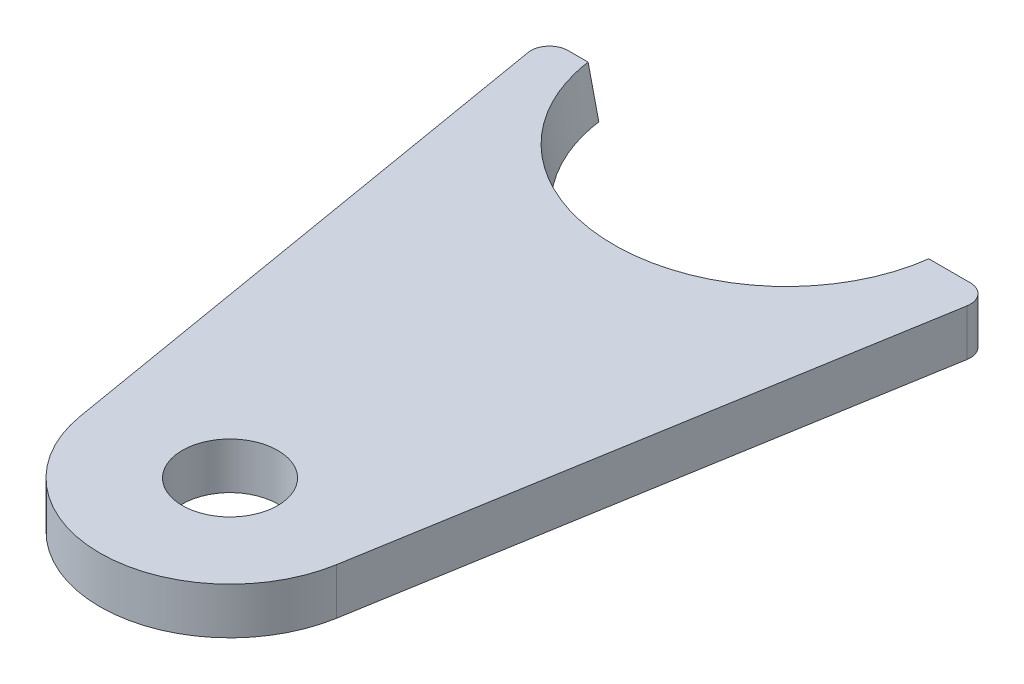
ISO-10303-21;
HEADER;
FILE_DESCRIPTION(('STEP AP214'),'2;1');
FILE_NAME('part.step','',(''),(''),'','','');
FILE_SCHEMA(('AUTOMOTIVE_DESIGN { 1 0 10303 214 1 1 1 1 }'));
ENDSEC;
DATA;
#1=APPLICATION_CONTEXT('core data for automotive mechanical design processes');
#2=APPLICATION_PROTOCOL_DEFINITION('international standard','automotive_design',2000,#1);
#3=PRODUCT_CONTEXT('',#1,'mechanical');
#4=PRODUCT('Part','Part','',(#3));
#5=PRODUCT_RELATED_PRODUCT_CATEGORY('part','',(#4));
#6=PRODUCT_DEFINITION_FORMATION('','',#4);
#7=PRODUCT_DEFINITION_CONTEXT('part definition',#1,'design');
#8=PRODUCT_DEFINITION('design','',#6,#7);
#9=PRODUCT_DEFINITION_SHAPE('','',#8);
#10=(LENGTH_UNIT() NAMED_UNIT(*) SI_UNIT(.MILLI.,.METRE.));
#11=(NAMED_UNIT(*) PLANE_ANGLE_UNIT() SI_UNIT($,.RADIAN.));
#12=(NAMED_UNIT(*) SI_UNIT($,.STERADIAN.) SOLID_ANGLE_UNIT());
#13=UNCERTAINTY_MEASURE_WITH_UNIT(LENGTH_MEASURE(1.E-05),#10,'distance_accuracy_value','');
#14=(GEOMETRIC_REPRESENTATION_CONTEXT(3) GLOBAL_UNCERTAINTY_ASSIGNED_CONTEXT((#13)) GLOBAL_UNIT_ASSIGNED_CONTEXT((#10,
#11,#12)) REPRESENTATION_CONTEXT('',''));
#15=CARTESIAN_POINT('',(0.,0.,0.));
#16=DIRECTION('',(0.,0.,1.));
#17=DIRECTION('',(1.,0.,0.));
#18=AXIS2_PLACEMENT_3D('',#15,#16,#17);
#19=CARTESIAN_POINT('',(0.,3.175,-36.83));
#20=DIRECTION('',(0.,0.,1.));
#21=DIRECTION('',(-1.,0.,0.));
#22=AXIS2_PLACEMENT_3D('',#19,#20,#21);
#23=PLANE('',#22);
#24=DIRECTION('',(1.,0.,0.));
#25=VECTOR('',#24,1.);
#26=CARTESIAN_POINT('',(0.,0.,-36.83));
#27=LINE('',#26,#25);
#28=CARTESIAN_POINT('',(11.6522737852072,0.,-36.83));
#29=VERTEX_POINT('',#28);
#30=CARTESIAN_POINT('',(13.7373742029562,0.,-36.83));
#31=VERTEX_POINT('',#30);
#32=EDGE_CURVE('E142',#29,#31,#27,.T.);
#33=ORIENTED_EDGE('',*,*,#32,.F.);
#34=CARTESIAN_POINT('',(15.4654164635902,-66.1988718553639,-36.83));
#35=DIRECTION('',(0.,0.,-1.));
#36=DIRECTION('',(0.227494846304663,-0.973779284491521,0.));
#37=AXIS2_PLACEMENT_3D('',#34,#35,#36);
#38=ELLIPSE('',#37,542.25801557008,11.43);
#39=CARTESIAN_POINT('',(10.9017405762271,3.175,-36.83));
#40=VERTEX_POINT('',#39);
#41=EDGE_CURVE('E123',#29,#40,#38,.F.);
#42=ORIENTED_EDGE('',*,*,#41,.T.);
#43=DIRECTION('',(1.,0.,0.));
#44=VECTOR('',#43,1.);
#45=CARTESIAN_POINT('',(0.,3.175,-36.83));
#46=LINE('',#45,#44);
#47=CARTESIAN_POINT('',(13.7373742029562,3.175,-36.83));
#48=VERTEX_POINT('',#47);
#49=EDGE_CURVE('E205',#40,#48,#46,.T.);
#50=ORIENTED_EDGE('',*,*,#49,.T.);
#51=DIRECTION('',(0.,-1.,0.));
#52=VECTOR('',#51,1.);
#53=CARTESIAN_POINT('',(13.7373742029562,3.175,-36.83));
#54=LINE('',#53,#52);
#55=EDGE_CURVE('E11',#31,#48,#54,.F.);
#56=ORIENTED_EDGE('',*,*,#55,.F.);
#57=EDGE_LOOP('',(#33,#42,#50,#56));
#58=FACE_BOUND('',#57,.T.);
#59=ADVANCED_FACE('F51',(#58),#23,.F.);
#60=CARTESIAN_POINT('',(-8.76571505055445,3.175,1.48133036574667));
#61=DIRECTION('',(-0.986019690726035,0.,0.166628837541807));
#62=DIRECTION('',(-0.166628837541807,0.,-0.986019690726035));
#63=AXIS2_PLACEMENT_3D('',#60,#61,#62);
#64=PLANE('',#63);
#65=DIRECTION('',(0.166628837541807,0.,0.986019690726035));
#66=VECTOR('',#65,1.);
#67=CARTESIAN_POINT('',(-8.76571505055445,0.,1.48133036574667));
#68=LINE('',#67,#66);
#69=CARTESIAN_POINT('',(-14.9896192101783,0.,-35.3483813763219));
#70=VERTEX_POINT('',#69);
#71=CARTESIAN_POINT('',(-8.76571505055445,0.,1.48133036574667));
#72=VERTEX_POINT('',#71);
#73=EDGE_CURVE('E151',#70,#72,#68,.T.);
#74=ORIENTED_EDGE('',*,*,#73,.T.);
#75=DIRECTION('',(0.,-1.,0.));
#76=VECTOR('',#75,1.);
#77=CARTESIAN_POINT('',(-8.76571505055445,3.175,1.48133036574667));
#78=LINE('',#77,#76);
#79=CARTESIAN_POINT('',(-8.76571505055445,3.175,1.48133036574667));
#80=VERTEX_POINT('',#79);
#81=EDGE_CURVE('E140',#80,#72,#78,.T.);
#82=ORIENTED_EDGE('',*,*,#81,.F.);
#83=DIRECTION('',(0.166628837541807,0.,0.986019690726035));
#84=VECTOR('',#83,1.);
#85=CARTESIAN_POINT('',(-8.76571505055445,3.175,1.48133036574667));
#86=LINE('',#85,#84);
#87=CARTESIAN_POINT('',(-14.9896192101783,3.175,-35.3483813763219));
#88=VERTEX_POINT('',#87);
#89=EDGE_CURVE('E206',#88,#80,#86,.T.);
#90=ORIENTED_EDGE('',*,*,#89,.F.);
#91=DIRECTION('',(0.,-1.,0.));
#92=VECTOR('',#91,1.);
#93=CARTESIAN_POINT('',(-14.9896192101783,3.175,-35.3483813763219));
#94=LINE('',#93,#92);
#95=EDGE_CURVE('E168',#70,#88,#94,.F.);
#96=ORIENTED_EDGE('',*,*,#95,.F.);
#97=EDGE_LOOP('',(#74,#82,#90,#96));
#98=FACE_BOUND('',#97,.T.);
#99=ADVANCED_FACE('F224',(#98),#64,.T.);
#100=CARTESIAN_POINT('',(-13.7373742029562,3.175,-36.83));
#101=VERTEX_POINT('',#100);
#102=CARTESIAN_POINT('',(-12.3700435462939,3.175,-36.83));
#103=VERTEX_POINT('',#102);
#104=EDGE_CURVE('E145',#101,#103,#46,.T.);
#105=ORIENTED_EDGE('',*,*,#104,.T.);
#106=CARTESIAN_POINT('',(-11.6377813782447,0.,-36.83));
#107=VERTEX_POINT('',#106);
#108=EDGE_CURVE('E120',#103,#107,#38,.F.);
#109=ORIENTED_EDGE('',*,*,#108,.T.);
#110=CARTESIAN_POINT('',(-13.7373742029562,0.,-36.83));
#111=VERTEX_POINT('',#110);
#112=EDGE_CURVE('E130',#111,#107,#27,.T.);
#113=ORIENTED_EDGE('',*,*,#112,.F.);
#114=DIRECTION('',(0.,-1.,0.));
#115=VECTOR('',#114,1.);
#116=CARTESIAN_POINT('',(-13.7373742029562,0.,-36.83));
#117=LINE('',#116,#115);
#118=EDGE_CURVE('E156',#101,#111,#117,.T.);
#119=ORIENTED_EDGE('',*,*,#118,.F.);
#120=EDGE_LOOP('',(#105,#109,#113,#119));
#121=FACE_BOUND('',#120,.T.);
#122=ADVANCED_FACE('F143',(#121),#23,.F.);
#123=CARTESIAN_POINT('',(8.76571505055446,3.175,1.48133036574667));
#124=DIRECTION('',(-0.986019690726035,0.,-0.166628837541808));
#125=DIRECTION('',(0.166628837541808,0.,-0.986019690726035));
#126=AXIS2_PLACEMENT_3D('',#123,#124,#125);
#127=PLANE('',#126);
#128=DIRECTION('',(-0.166628837541808,0.,0.986019690726035));
#129=VECTOR('',#128,1.);
#130=CARTESIAN_POINT('',(8.76571505055446,3.175,1.48133036574667));
#131=LINE('',#130,#129);
#132=CARTESIAN_POINT('',(14.9896192101783,3.175,-35.3483813763219));
#133=VERTEX_POINT('',#132);
#134=CARTESIAN_POINT('',(8.76571505055445,3.175,1.48133036574667));
#135=VERTEX_POINT('',#134);
#136=EDGE_CURVE('E202',#133,#135,#131,.T.);
#137=ORIENTED_EDGE('',*,*,#136,.T.);
#138=DIRECTION('',(0.,-1.,0.));
#139=VECTOR('',#138,1.);
#140=CARTESIAN_POINT('',(8.76571505055445,3.175,1.48133036574667));
#141=LINE('',#140,#139);
#142=CARTESIAN_POINT('',(8.76571505055445,0.,1.48133036574667));
#143=VERTEX_POINT('',#142);
#144=EDGE_CURVE('E185',#135,#143,#141,.T.);
#145=ORIENTED_EDGE('',*,*,#144,.T.);
#146=DIRECTION('',(-0.166628837541808,0.,0.986019690726035));
#147=VECTOR('',#146,1.);
#148=CARTESIAN_POINT('',(8.76571505055446,0.,1.48133036574667));
#149=LINE('',#148,#147);
#150=CARTESIAN_POINT('',(14.9896192101783,0.,-35.3483813763219));
#151=VERTEX_POINT('',#150);
#152=EDGE_CURVE('E139',#151,#143,#149,.T.);
#153=ORIENTED_EDGE('',*,*,#152,.F.);
#154=DIRECTION('',(0.,-1.,0.));
#155=VECTOR('',#154,1.);
#156=CARTESIAN_POINT('',(14.9896192101783,3.175,-35.3483813763219));
#157=LINE('',#156,#155);
#158=EDGE_CURVE('E60',#133,#151,#157,.T.);
#159=ORIENTED_EDGE('',*,*,#158,.F.);
#160=EDGE_LOOP('',(#137,#145,#153,#159));
#161=FACE_BOUND('',#160,.T.);
#162=ADVANCED_FACE('F183',(#161),#127,.F.);
#163=CARTESIAN_POINT('',(0.,3.175,0.));
#164=DIRECTION('',(0.,-1.,0.));
#165=DIRECTION('',(0.,0.,1.));
#166=AXIS2_PLACEMENT_3D('',#163,#164,#165);
#167=CYLINDRICAL_SURFACE('',#166,8.89);
#168=CARTESIAN_POINT('',(0.,0.,0.));
#169=DIRECTION('',(0.,-1.,0.));
#170=DIRECTION('',(0.,0.,-1.));
#171=AXIS2_PLACEMENT_3D('',#168,#169,#170);
#172=CIRCLE('',#171,8.89);
#173=EDGE_CURVE('E187',#143,#72,#172,.T.);
#174=ORIENTED_EDGE('',*,*,#173,.F.);
#175=ORIENTED_EDGE('',*,*,#144,.F.);
#176=CARTESIAN_POINT('',(0.,3.175,0.));
#177=DIRECTION('',(0.,-1.,0.));
#178=DIRECTION('',(0.,0.,-1.));
#179=AXIS2_PLACEMENT_3D('',#176,#177,#178);
#180=CIRCLE('',#179,8.89);
#181=EDGE_CURVE('E195',#135,#80,#180,.T.);
#182=ORIENTED_EDGE('',*,*,#181,.T.);
#183=ORIENTED_EDGE('',*,*,#81,.T.);
#184=EDGE_LOOP('',(#174,#175,#182,#183));
#185=FACE_BOUND('',#184,.T.);
#186=ADVANCED_FACE('F220',(#185),#167,.T.);
#187=CARTESIAN_POINT('',(0.,3.175,0.));
#188=DIRECTION('',(0.,-1.,0.));
#189=DIRECTION('',(0.,0.,1.));
#190=AXIS2_PLACEMENT_3D('',#187,#188,#189);
#191=CYLINDRICAL_SURFACE('',#190,3.2639);
#192=CARTESIAN_POINT('',(0.,3.175,0.));
#193=DIRECTION('',(0.,-1.,0.));
#194=DIRECTION('',(0.,0.,-1.));
#195=AXIS2_PLACEMENT_3D('',#192,#193,#194);
#196=CIRCLE('',#195,3.2639);
#197=CARTESIAN_POINT('',(0.,3.175,-3.2639));
#198=VERTEX_POINT('',#197);
#199=EDGE_CURVE('E196',#198,#198,#196,.T.);
#200=ORIENTED_EDGE('',*,*,#199,.F.);
#201=EDGE_LOOP('',(#200));
#202=FACE_BOUND('',#201,.T.);
#203=CARTESIAN_POINT('',(0.,0.,0.));
#204=DIRECTION('',(0.,-1.,0.));
#205=DIRECTION('',(0.,0.,-1.));
#206=AXIS2_PLACEMENT_3D('',#203,#204,#205);
#207=CIRCLE('',#206,3.2639);
#208=CARTESIAN_POINT('',(0.,0.,-3.2639));
#209=VERTEX_POINT('',#208);
#210=EDGE_CURVE('E147',#209,#209,#207,.T.);
#211=ORIENTED_EDGE('',*,*,#210,.T.);
#212=EDGE_LOOP('',(#211));
#213=FACE_BOUND('',#212,.T.);
#214=ADVANCED_FACE('F244',(#202,#213),#191,.F.);
#215=CARTESIAN_POINT('',(0.,3.175,0.));
#216=DIRECTION('',(0.,1.,0.));
#217=DIRECTION('',(0.,0.,-1.));
#218=AXIS2_PLACEMENT_3D('',#215,#216,#217);
#219=PLANE('',#218);
#220=ORIENTED_EDGE('',*,*,#89,.T.);
#221=ORIENTED_EDGE('',*,*,#181,.F.);
#222=ORIENTED_EDGE('',*,*,#136,.F.);
#223=CARTESIAN_POINT('',(13.7373742029562,3.175,-35.56));
#224=DIRECTION('',(0.,-1.,0.));
#225=DIRECTION('',(0.,0.,-1.));
#226=AXIS2_PLACEMENT_3D('',#223,#224,#225);
#227=CIRCLE('',#226,1.27);
#228=EDGE_CURVE('E66',#48,#133,#227,.T.);
#229=ORIENTED_EDGE('',*,*,#228,.F.);
#230=ORIENTED_EDGE('',*,*,#49,.F.);
#231=CARTESIAN_POINT('',(-0.741745227610072,3.17500000000001,-38.3320076797842));
#232=DIRECTION('',(0.,-1.,0.));
#233=DIRECTION('',(0.995733086920544,0.,0.0922801149310388));
#234=AXIS2_PLACEMENT_3D('',#231,#232,#233);
#235=ELLIPSE('',#234,11.7403812419305,11.43);
#236=EDGE_CURVE('E209',#103,#40,#235,.F.);
#237=ORIENTED_EDGE('',*,*,#236,.F.);
#238=ORIENTED_EDGE('',*,*,#104,.F.);
#239=CARTESIAN_POINT('',(-13.7373742029562,3.175,-35.56));
#240=DIRECTION('',(0.,-1.,0.));
#241=DIRECTION('',(0.,0.,-1.));
#242=AXIS2_PLACEMENT_3D('',#239,#240,#241);
#243=CIRCLE('',#242,1.27);
#244=EDGE_CURVE('E174',#88,#101,#243,.T.);
#245=ORIENTED_EDGE('',*,*,#244,.F.);
#246=EDGE_LOOP('',(#220,#221,#222,#229,#230,#237,#238,#245));
#247=FACE_BOUND('',#246,.T.);
#248=ORIENTED_EDGE('',*,*,#199,.T.);
#249=EDGE_LOOP('',(#248));
#250=FACE_BOUND('',#249,.T.);
#251=ADVANCED_FACE('F226',(#247,#250),#219,.T.);
#252=CARTESIAN_POINT('',(0.,0.,0.));
#253=DIRECTION('',(0.,1.,0.));
#254=DIRECTION('',(0.,0.,-1.));
#255=AXIS2_PLACEMENT_3D('',#252,#253,#254);
#256=PLANE('',#255);
#257=ORIENTED_EDGE('',*,*,#112,.T.);
#258=CARTESIAN_POINT('',(1.80411241501588E-13,0.,-38.2632660302874));
#259=DIRECTION('',(0.,-1.,0.));
#260=DIRECTION('',(0.995733086920544,0.,0.0922801149310388));
#261=AXIS2_PLACEMENT_3D('',#258,#259,#260);
#262=ELLIPSE('',#261,11.7403812419305,11.43);
#263=EDGE_CURVE('E116',#107,#29,#262,.F.);
#264=ORIENTED_EDGE('',*,*,#263,.T.);
#265=ORIENTED_EDGE('',*,*,#32,.T.);
#266=CARTESIAN_POINT('',(13.7373742029562,0.,-35.56));
#267=DIRECTION('',(0.,-1.,0.));
#268=DIRECTION('',(0.,0.,-1.));
#269=AXIS2_PLACEMENT_3D('',#266,#267,#268);
#270=CIRCLE('',#269,1.27);
#271=EDGE_CURVE('E160',#151,#31,#270,.F.);
#272=ORIENTED_EDGE('',*,*,#271,.F.);
#273=ORIENTED_EDGE('',*,*,#152,.T.);
#274=ORIENTED_EDGE('',*,*,#173,.T.);
#275=ORIENTED_EDGE('',*,*,#73,.F.);
#276=CARTESIAN_POINT('',(-13.7373742029562,0.,-35.56));
#277=DIRECTION('',(0.,-1.,0.));
#278=DIRECTION('',(0.,0.,-1.));
#279=AXIS2_PLACEMENT_3D('',#276,#277,#278);
#280=CIRCLE('',#279,1.27);
#281=EDGE_CURVE('E134',#111,#70,#280,.F.);
#282=ORIENTED_EDGE('',*,*,#281,.F.);
#283=EDGE_LOOP('',(#257,#264,#265,#272,#273,#274,#275,#282));
#284=FACE_BOUND('',#283,.T.);
#285=ORIENTED_EDGE('',*,*,#210,.F.);
#286=EDGE_LOOP('',(#285));
#287=FACE_BOUND('',#286,.T.);
#288=ADVANCED_FACE('F131',(#284,#287),#256,.F.);
#289=CARTESIAN_POINT('',(-38.3279361291009,164.060640608313,-41.8153287241177));
#290=DIRECTION('',(0.22744430222249,-0.973562933303906,0.0210785265903051));
#291=DIRECTION('',(-0.0922801149310373,0.,0.995733086920544));
#292=AXIS2_PLACEMENT_3D('',#289,#290,#291);
#293=CYLINDRICAL_SURFACE('',#292,11.43);
#294=ORIENTED_EDGE('',*,*,#108,.F.);
#295=ORIENTED_EDGE('',*,*,#236,.T.);
#296=ORIENTED_EDGE('',*,*,#41,.F.);
#297=ORIENTED_EDGE('',*,*,#263,.F.);
#298=EDGE_LOOP('',(#294,#295,#296,#297));
#299=FACE_BOUND('',#298,.T.);
#300=ADVANCED_FACE('F118',(#299),#293,.F.);
#301=CARTESIAN_POINT('',(-13.7373742029562,3.175,-35.56));
#302=DIRECTION('',(0.,1.,0.));
#303=DIRECTION('',(0.,0.,-1.));
#304=AXIS2_PLACEMENT_3D('',#301,#302,#303);
#305=CYLINDRICAL_SURFACE('',#304,1.27);
#306=ORIENTED_EDGE('',*,*,#244,.T.);
#307=ORIENTED_EDGE('',*,*,#118,.T.);
#308=ORIENTED_EDGE('',*,*,#281,.T.);
#309=ORIENTED_EDGE('',*,*,#95,.T.);
#310=EDGE_LOOP('',(#306,#307,#308,#309));
#311=FACE_BOUND('',#310,.T.);
#312=ADVANCED_FACE('F225',(#311),#305,.T.);
#313=CARTESIAN_POINT('',(13.7373742029562,3.175,-35.56));
#314=DIRECTION('',(0.,-1.,0.));
#315=DIRECTION('',(0.,0.,1.));
#316=AXIS2_PLACEMENT_3D('',#313,#314,#315);
#317=CYLINDRICAL_SURFACE('',#316,1.27);
#318=ORIENTED_EDGE('',*,*,#228,.T.);
#319=ORIENTED_EDGE('',*,*,#158,.T.);
#320=ORIENTED_EDGE('',*,*,#271,.T.);
#321=ORIENTED_EDGE('',*,*,#55,.T.);
#322=EDGE_LOOP('',(#318,#319,#320,#321));
#323=FACE_BOUND('',#322,.T.);
#324=ADVANCED_FACE('F53',(#323),#317,.T.);
#325=CLOSED_SHELL('',(#59,#99,#122,#162,#186,#214,#251,#288,#300,#312,#324));
#326=MANIFOLD_SOLID_BREP('B2',#325);
#327=ADVANCED_BREP_SHAPE_REPRESENTATION('',(#18,#326),#14);
#328=SHAPE_DEFINITION_REPRESENTATION(#9,#327);
ENDSEC;
END-ISO-10303-21;
